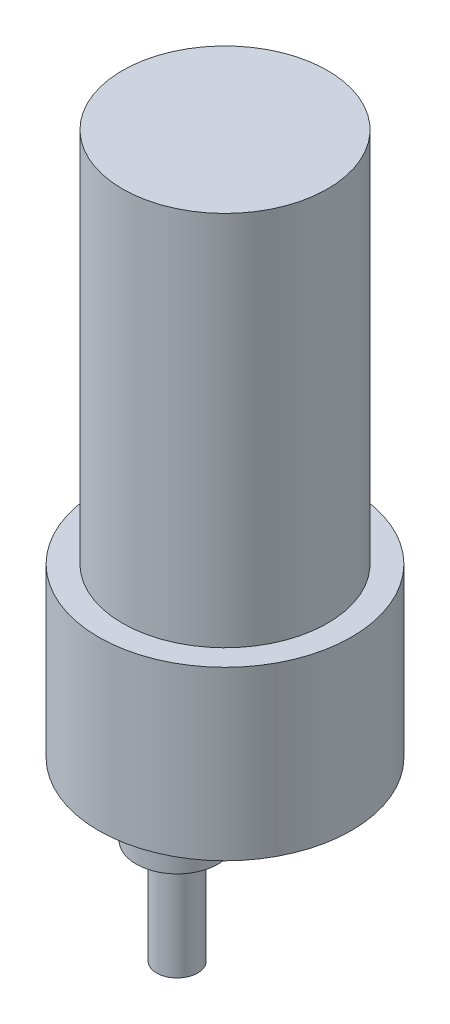
ISO-10303-21;
HEADER;
FILE_DESCRIPTION(('STEP AP214'),'2;1');
FILE_NAME('part.step','',(''),(''),'','','');
FILE_SCHEMA(('AUTOMOTIVE_DESIGN { 1 0 10303 214 1 1 1 1 }'));
ENDSEC;
DATA;
#1=APPLICATION_CONTEXT('core data for automotive mechanical design processes');
#2=APPLICATION_PROTOCOL_DEFINITION('international standard','automotive_design',2000,#1);
#3=PRODUCT_CONTEXT('',#1,'mechanical');
#4=PRODUCT('Part','Part','',(#3));
#5=PRODUCT_RELATED_PRODUCT_CATEGORY('part','',(#4));
#6=PRODUCT_DEFINITION_FORMATION('','',#4);
#7=PRODUCT_DEFINITION_CONTEXT('part definition',#1,'design');
#8=PRODUCT_DEFINITION('design','',#6,#7);
#9=PRODUCT_DEFINITION_SHAPE('','',#8);
#10=(LENGTH_UNIT() NAMED_UNIT(*) SI_UNIT(.MILLI.,.METRE.));
#11=(NAMED_UNIT(*) PLANE_ANGLE_UNIT() SI_UNIT($,.RADIAN.));
#12=(NAMED_UNIT(*) SI_UNIT($,.STERADIAN.) SOLID_ANGLE_UNIT());
#13=UNCERTAINTY_MEASURE_WITH_UNIT(LENGTH_MEASURE(1.E-05),#10,'distance_accuracy_value','');
#14=(GEOMETRIC_REPRESENTATION_CONTEXT(3) GLOBAL_UNCERTAINTY_ASSIGNED_CONTEXT((#13)) GLOBAL_UNIT_ASSIGNED_CONTEXT((#10,
#11,#12)) REPRESENTATION_CONTEXT('',''));
#15=CARTESIAN_POINT('',(0.,0.,0.));
#16=DIRECTION('',(0.,0.,1.));
#17=DIRECTION('',(1.,0.,0.));
#18=AXIS2_PLACEMENT_3D('',#15,#16,#17);
#19=CARTESIAN_POINT('',(0.,24.5,0.));
#20=DIRECTION('',(0.,-1.,0.));
#21=DIRECTION('',(0.,0.,-1.));
#22=AXIS2_PLACEMENT_3D('',#19,#20,#21);
#23=CYLINDRICAL_SURFACE('',#22,18.5);
#24=CARTESIAN_POINT('',(0.,24.5,0.));
#25=DIRECTION('',(0.,1.,0.));
#26=DIRECTION('',(0.,0.,1.));
#27=AXIS2_PLACEMENT_3D('',#24,#25,#26);
#28=CIRCLE('',#27,18.5);
#29=CARTESIAN_POINT('',(0.,24.5,18.5));
#30=VERTEX_POINT('',#29);
#31=EDGE_CURVE('E151',#30,#30,#28,.T.);
#32=ORIENTED_EDGE('',*,*,#31,.F.);
#33=EDGE_LOOP('',(#32));
#34=FACE_BOUND('',#33,.T.);
#35=CARTESIAN_POINT('',(0.,0.,0.));
#36=DIRECTION('',(0.,1.,0.));
#37=DIRECTION('',(0.,0.,1.));
#38=AXIS2_PLACEMENT_3D('',#35,#36,#37);
#39=CIRCLE('',#38,18.5);
#40=CARTESIAN_POINT('',(0.,0.,18.5));
#41=VERTEX_POINT('',#40);
#42=EDGE_CURVE('E41',#41,#41,#39,.T.);
#43=ORIENTED_EDGE('',*,*,#42,.T.);
#44=EDGE_LOOP('',(#43));
#45=FACE_BOUND('',#44,.T.);
#46=ADVANCED_FACE('F38',(#34,#45),#23,.T.);
#47=CARTESIAN_POINT('',(0.,24.5,0.));
#48=DIRECTION('',(0.,1.,0.));
#49=DIRECTION('',(0.,0.,1.));
#50=AXIS2_PLACEMENT_3D('',#47,#48,#49);
#51=PLANE('',#50);
#52=CARTESIAN_POINT('',(0.,24.5,0.));
#53=DIRECTION('',(0.,1.,0.));
#54=DIRECTION('',(0.,0.,1.));
#55=AXIS2_PLACEMENT_3D('',#52,#53,#54);
#56=CIRCLE('',#55,15.);
#57=CARTESIAN_POINT('',(0.,24.5,15.));
#58=VERTEX_POINT('',#57);
#59=EDGE_CURVE('E46',#58,#58,#56,.T.);
#60=ORIENTED_EDGE('',*,*,#59,.F.);
#61=EDGE_LOOP('',(#60));
#62=FACE_BOUND('',#61,.T.);
#63=ORIENTED_EDGE('',*,*,#31,.T.);
#64=EDGE_LOOP('',(#63));
#65=FACE_BOUND('',#64,.T.);
#66=ADVANCED_FACE('F162',(#62,#65),#51,.T.);
#67=CARTESIAN_POINT('',(0.,0.,0.));
#68=DIRECTION('',(0.,1.,0.));
#69=DIRECTION('',(0.,0.,1.));
#70=AXIS2_PLACEMENT_3D('',#67,#68,#69);
#71=PLANE('',#70);
#72=CARTESIAN_POINT('',(7.75000000000016,0.,13.4233937586587));
#73=DIRECTION('',(0.,-1.,0.));
#74=DIRECTION('',(0.,0.,-1.));
#75=AXIS2_PLACEMENT_3D('',#72,#73,#74);
#76=CIRCLE('',#75,1.24999999999999);
#77=CARTESIAN_POINT('',(7.75000000000016,0.,12.1733937586587));
#78=VERTEX_POINT('',#77);
#79=EDGE_CURVE('E97',#78,#78,#76,.T.);
#80=ORIENTED_EDGE('',*,*,#79,.F.);
#81=EDGE_LOOP('',(#80));
#82=FACE_BOUND('',#81,.T.);
#83=CARTESIAN_POINT('',(-7.74999999999988,0.,13.4233937586589));
#84=DIRECTION('',(0.,-1.,0.));
#85=DIRECTION('',(0.,0.,-1.));
#86=AXIS2_PLACEMENT_3D('',#83,#84,#85);
#87=CIRCLE('',#86,1.24999999999999);
#88=CARTESIAN_POINT('',(-7.74999999999988,0.,12.1733937586589));
#89=VERTEX_POINT('',#88);
#90=EDGE_CURVE('E96',#89,#89,#87,.T.);
#91=ORIENTED_EDGE('',*,*,#90,.F.);
#92=EDGE_LOOP('',(#91));
#93=FACE_BOUND('',#92,.T.);
#94=CARTESIAN_POINT('',(-15.5,0.,0.));
#95=DIRECTION('',(0.,-1.,0.));
#96=DIRECTION('',(0.,0.,-1.));
#97=AXIS2_PLACEMENT_3D('',#94,#95,#96);
#98=CIRCLE('',#97,1.24999999999999);
#99=CARTESIAN_POINT('',(-15.5,0.,-1.24999999999999));
#100=VERTEX_POINT('',#99);
#101=EDGE_CURVE('E107',#100,#100,#98,.T.);
#102=ORIENTED_EDGE('',*,*,#101,.F.);
#103=EDGE_LOOP('',(#102));
#104=FACE_BOUND('',#103,.T.);
#105=CARTESIAN_POINT('',(-7.75000000000006,0.,-13.4233937586588));
#106=DIRECTION('',(0.,-1.,0.));
#107=DIRECTION('',(0.,0.,-1.));
#108=AXIS2_PLACEMENT_3D('',#105,#106,#107);
#109=CIRCLE('',#108,1.24999999999999);
#110=CARTESIAN_POINT('',(-7.75000000000006,0.,-14.6733937586588));
#111=VERTEX_POINT('',#110);
#112=EDGE_CURVE('E113',#111,#111,#109,.T.);
#113=ORIENTED_EDGE('',*,*,#112,.F.);
#114=EDGE_LOOP('',(#113));
#115=FACE_BOUND('',#114,.T.);
#116=CARTESIAN_POINT('',(7.74999999999997,0.,-13.4233937586588));
#117=DIRECTION('',(0.,-1.,0.));
#118=DIRECTION('',(0.,0.,-1.));
#119=AXIS2_PLACEMENT_3D('',#116,#117,#118);
#120=CIRCLE('',#119,1.24999999999999);
#121=CARTESIAN_POINT('',(7.74999999999997,0.,-14.6733937586588));
#122=VERTEX_POINT('',#121);
#123=EDGE_CURVE('E119',#122,#122,#120,.T.);
#124=ORIENTED_EDGE('',*,*,#123,.F.);
#125=EDGE_LOOP('',(#124));
#126=FACE_BOUND('',#125,.T.);
#127=CARTESIAN_POINT('',(15.5,0.,0.));
#128=DIRECTION('',(0.,-1.,0.));
#129=DIRECTION('',(0.,0.,-1.));
#130=AXIS2_PLACEMENT_3D('',#127,#128,#129);
#131=CIRCLE('',#130,1.24999999999999);
#132=CARTESIAN_POINT('',(15.5,0.,-1.24999999999999));
#133=VERTEX_POINT('',#132);
#134=EDGE_CURVE('E125',#133,#133,#131,.T.);
#135=ORIENTED_EDGE('',*,*,#134,.F.);
#136=EDGE_LOOP('',(#135));
#137=FACE_BOUND('',#136,.T.);
#138=CARTESIAN_POINT('',(0.,0.,7.));
#139=DIRECTION('',(0.,1.,0.));
#140=DIRECTION('',(0.,0.,1.));
#141=AXIS2_PLACEMENT_3D('',#138,#139,#140);
#142=CIRCLE('',#141,6.);
#143=CARTESIAN_POINT('',(0.,0.,13.));
#144=VERTEX_POINT('',#143);
#145=EDGE_CURVE('E140',#144,#144,#142,.T.);
#146=ORIENTED_EDGE('',*,*,#145,.T.);
#147=EDGE_LOOP('',(#146));
#148=FACE_BOUND('',#147,.T.);
#149=ORIENTED_EDGE('',*,*,#42,.F.);
#150=EDGE_LOOP('',(#149));
#151=FACE_BOUND('',#150,.T.);
#152=ADVANCED_FACE('F159',(#82,#93,#104,#115,#126,#137,#148,#151),#71,.F.);
#153=CARTESIAN_POINT('',(0.,79.5,0.));
#154=DIRECTION('',(0.,-1.,0.));
#155=DIRECTION('',(0.,0.,-1.));
#156=AXIS2_PLACEMENT_3D('',#153,#154,#155);
#157=CYLINDRICAL_SURFACE('',#156,15.);
#158=CARTESIAN_POINT('',(0.,79.5,0.));
#159=DIRECTION('',(0.,1.,0.));
#160=DIRECTION('',(0.,0.,1.));
#161=AXIS2_PLACEMENT_3D('',#158,#159,#160);
#162=CIRCLE('',#161,15.);
#163=CARTESIAN_POINT('',(0.,79.5,15.));
#164=VERTEX_POINT('',#163);
#165=EDGE_CURVE('E145',#164,#164,#162,.T.);
#166=ORIENTED_EDGE('',*,*,#165,.F.);
#167=EDGE_LOOP('',(#166));
#168=FACE_BOUND('',#167,.T.);
#169=ORIENTED_EDGE('',*,*,#59,.T.);
#170=EDGE_LOOP('',(#169));
#171=FACE_BOUND('',#170,.T.);
#172=ADVANCED_FACE('F161',(#168,#171),#157,.T.);
#173=CARTESIAN_POINT('',(0.,79.5,0.));
#174=DIRECTION('',(0.,1.,0.));
#175=DIRECTION('',(0.,0.,1.));
#176=AXIS2_PLACEMENT_3D('',#173,#174,#175);
#177=PLANE('',#176);
#178=ORIENTED_EDGE('',*,*,#165,.T.);
#179=EDGE_LOOP('',(#178));
#180=FACE_BOUND('',#179,.T.);
#181=ADVANCED_FACE('F168',(#180),#177,.T.);
#182=CARTESIAN_POINT('',(0.,-7.,7.));
#183=DIRECTION('',(0.,1.,0.));
#184=DIRECTION('',(0.,0.,1.));
#185=AXIS2_PLACEMENT_3D('',#182,#183,#184);
#186=CYLINDRICAL_SURFACE('',#185,6.);
#187=CARTESIAN_POINT('',(0.,-7.,7.));
#188=DIRECTION('',(0.,1.,0.));
#189=DIRECTION('',(0.,0.,1.));
#190=AXIS2_PLACEMENT_3D('',#187,#188,#189);
#191=CIRCLE('',#190,6.);
#192=CARTESIAN_POINT('',(0.,-7.,13.));
#193=VERTEX_POINT('',#192);
#194=EDGE_CURVE('E142',#193,#193,#191,.T.);
#195=ORIENTED_EDGE('',*,*,#194,.T.);
#196=EDGE_LOOP('',(#195));
#197=FACE_BOUND('',#196,.T.);
#198=ORIENTED_EDGE('',*,*,#145,.F.);
#199=EDGE_LOOP('',(#198));
#200=FACE_BOUND('',#199,.T.);
#201=ADVANCED_FACE('F199',(#197,#200),#186,.T.);
#202=CARTESIAN_POINT('',(0.,-7.,7.));
#203=DIRECTION('',(0.,1.,0.));
#204=DIRECTION('',(0.,0.,1.));
#205=AXIS2_PLACEMENT_3D('',#202,#203,#204);
#206=PLANE('',#205);
#207=CARTESIAN_POINT('',(0.,-7.,7.));
#208=DIRECTION('',(0.,-1.,0.));
#209=DIRECTION('',(0.,0.,-1.));
#210=AXIS2_PLACEMENT_3D('',#207,#208,#209);
#211=CIRCLE('',#210,3.);
#212=CARTESIAN_POINT('',(0.,-7.,4.));
#213=VERTEX_POINT('',#212);
#214=EDGE_CURVE('E11',#213,#213,#211,.T.);
#215=ORIENTED_EDGE('',*,*,#214,.F.);
#216=EDGE_LOOP('',(#215));
#217=FACE_BOUND('',#216,.T.);
#218=ORIENTED_EDGE('',*,*,#194,.F.);
#219=EDGE_LOOP('',(#218));
#220=FACE_BOUND('',#219,.T.);
#221=ADVANCED_FACE('F209',(#217,#220),#206,.F.);
#222=CARTESIAN_POINT('',(0.,-22.3,7.));
#223=DIRECTION('',(0.,1.,0.));
#224=DIRECTION('',(0.,0.,1.));
#225=AXIS2_PLACEMENT_3D('',#222,#223,#224);
#226=CYLINDRICAL_SURFACE('',#225,3.);
#227=CARTESIAN_POINT('',(0.,-22.3,7.));
#228=DIRECTION('',(0.,-1.,0.));
#229=DIRECTION('',(0.,0.,-1.));
#230=AXIS2_PLACEMENT_3D('',#227,#228,#229);
#231=CIRCLE('',#230,3.);
#232=CARTESIAN_POINT('',(1.73132896931808,-22.3,4.55));
#233=VERTEX_POINT('',#232);
#234=CARTESIAN_POINT('',(-1.73132896931808,-22.3,4.55));
#235=VERTEX_POINT('',#234);
#236=EDGE_CURVE('E137',#233,#235,#231,.T.);
#237=ORIENTED_EDGE('',*,*,#236,.F.);
#238=DIRECTION('',(0.,-1.,0.));
#239=VECTOR('',#238,1.);
#240=CARTESIAN_POINT('',(1.73132896931808,-10.3,4.55));
#241=LINE('',#240,#239);
#242=CARTESIAN_POINT('',(1.73132896931808,-10.3,4.55));
#243=VERTEX_POINT('',#242);
#244=EDGE_CURVE('E54',#243,#233,#241,.T.);
#245=ORIENTED_EDGE('',*,*,#244,.F.);
#246=CARTESIAN_POINT('',(0.,-10.3,7.));
#247=DIRECTION('',(0.,-1.,0.));
#248=DIRECTION('',(0.,0.,-1.));
#249=AXIS2_PLACEMENT_3D('',#246,#247,#248);
#250=CIRCLE('',#249,3.);
#251=CARTESIAN_POINT('',(-1.73132896931808,-10.3,4.55));
#252=VERTEX_POINT('',#251);
#253=EDGE_CURVE('E131',#252,#243,#250,.T.);
#254=ORIENTED_EDGE('',*,*,#253,.F.);
#255=DIRECTION('',(0.,-1.,0.));
#256=VECTOR('',#255,1.);
#257=CARTESIAN_POINT('',(-1.73132896931808,-10.3,4.55));
#258=LINE('',#257,#256);
#259=EDGE_CURVE('E60',#252,#235,#258,.T.);
#260=ORIENTED_EDGE('',*,*,#259,.T.);
#261=EDGE_LOOP('',(#237,#245,#254,#260));
#262=FACE_BOUND('',#261,.T.);
#263=ORIENTED_EDGE('',*,*,#214,.T.);
#264=EDGE_LOOP('',(#263));
#265=FACE_BOUND('',#264,.T.);
#266=ADVANCED_FACE('F219',(#262,#265),#226,.T.);
#267=CARTESIAN_POINT('',(0.,-22.3,7.));
#268=DIRECTION('',(0.,-1.,0.));
#269=DIRECTION('',(0.,0.,-1.));
#270=AXIS2_PLACEMENT_3D('',#267,#268,#269);
#271=PLANE('',#270);
#272=DIRECTION('',(-1.,0.,0.));
#273=VECTOR('',#272,1.);
#274=CARTESIAN_POINT('',(-1.73132896931808,-22.3,4.55));
#275=LINE('',#274,#273);
#276=EDGE_CURVE('E67',#233,#235,#275,.T.);
#277=ORIENTED_EDGE('',*,*,#276,.F.);
#278=ORIENTED_EDGE('',*,*,#236,.T.);
#279=EDGE_LOOP('',(#277,#278));
#280=FACE_BOUND('',#279,.T.);
#281=ADVANCED_FACE('F229',(#280),#271,.T.);
#282=CARTESIAN_POINT('',(-1.73132896931808,-10.3,4.55));
#283=DIRECTION('',(0.,0.,1.));
#284=DIRECTION('',(1.,0.,0.));
#285=AXIS2_PLACEMENT_3D('',#282,#283,#284);
#286=PLANE('',#285);
#287=ORIENTED_EDGE('',*,*,#276,.T.);
#288=ORIENTED_EDGE('',*,*,#259,.F.);
#289=DIRECTION('',(-1.,0.,0.));
#290=VECTOR('',#289,1.);
#291=CARTESIAN_POINT('',(-1.73132896931808,-10.3,4.55));
#292=LINE('',#291,#290);
#293=EDGE_CURVE('E133',#243,#252,#292,.T.);
#294=ORIENTED_EDGE('',*,*,#293,.F.);
#295=ORIENTED_EDGE('',*,*,#244,.T.);
#296=EDGE_LOOP('',(#287,#288,#294,#295));
#297=FACE_BOUND('',#296,.T.);
#298=ADVANCED_FACE('F239',(#297),#286,.F.);
#299=CARTESIAN_POINT('',(0.,-10.3,7.));
#300=DIRECTION('',(0.,-1.,0.));
#301=DIRECTION('',(0.,0.,-1.));
#302=AXIS2_PLACEMENT_3D('',#299,#300,#301);
#303=PLANE('',#302);
#304=ORIENTED_EDGE('',*,*,#253,.T.);
#305=ORIENTED_EDGE('',*,*,#293,.T.);
#306=EDGE_LOOP('',(#304,#305));
#307=FACE_BOUND('',#306,.T.);
#308=ADVANCED_FACE('F249',(#307),#303,.T.);
#309=CARTESIAN_POINT('',(15.5,5.,0.));
#310=DIRECTION('',(0.,-1.,0.));
#311=DIRECTION('',(0.,0.,-1.));
#312=AXIS2_PLACEMENT_3D('',#309,#310,#311);
#313=CONICAL_SURFACE('',#312,1.25,1.02974425867665);
#314=CARTESIAN_POINT('',(15.5,5.75107577378445,0.));
#315=VERTEX_POINT('',#314);
#316=VERTEX_LOOP('',#315);
#317=FACE_BOUND('',#316,.T.);
#318=CARTESIAN_POINT('',(15.5,5.,0.));
#319=DIRECTION('',(0.,-1.,0.));
#320=DIRECTION('',(0.,0.,-1.));
#321=AXIS2_PLACEMENT_3D('',#318,#319,#320);
#322=CIRCLE('',#321,1.25);
#323=CARTESIAN_POINT('',(15.5,5.,-1.25));
#324=VERTEX_POINT('',#323);
#325=EDGE_CURVE('E128',#324,#324,#322,.T.);
#326=ORIENTED_EDGE('',*,*,#325,.T.);
#327=EDGE_LOOP('',(#326));
#328=FACE_BOUND('',#327,.T.);
#329=ADVANCED_FACE('F258',(#317,#328),#313,.F.);
#330=CARTESIAN_POINT('',(15.5,0.,0.));
#331=DIRECTION('',(0.,-1.,0.));
#332=DIRECTION('',(0.,0.,-1.));
#333=AXIS2_PLACEMENT_3D('',#330,#331,#332);
#334=CYLINDRICAL_SURFACE('',#333,1.24999999999999);
#335=ORIENTED_EDGE('',*,*,#325,.F.);
#336=EDGE_LOOP('',(#335));
#337=FACE_BOUND('',#336,.T.);
#338=ORIENTED_EDGE('',*,*,#134,.T.);
#339=EDGE_LOOP('',(#338));
#340=FACE_BOUND('',#339,.T.);
#341=ADVANCED_FACE('F268',(#337,#340),#334,.F.);
#342=CARTESIAN_POINT('',(7.74999999999997,5.,-13.4233937586588));
#343=DIRECTION('',(0.,-1.,0.));
#344=DIRECTION('',(0.,0.,-1.));
#345=AXIS2_PLACEMENT_3D('',#342,#343,#344);
#346=CONICAL_SURFACE('',#345,1.25,1.02974425867665);
#347=CARTESIAN_POINT('',(7.74999999999997,5.75107577378445,-13.4233937586588));
#348=VERTEX_POINT('',#347);
#349=VERTEX_LOOP('',#348);
#350=FACE_BOUND('',#349,.T.);
#351=CARTESIAN_POINT('',(7.74999999999997,5.,-13.4233937586588));
#352=DIRECTION('',(0.,-1.,0.));
#353=DIRECTION('',(0.,0.,-1.));
#354=AXIS2_PLACEMENT_3D('',#351,#352,#353);
#355=CIRCLE('',#354,1.25);
#356=CARTESIAN_POINT('',(7.74999999999997,5.,-14.6733937586588));
#357=VERTEX_POINT('',#356);
#358=EDGE_CURVE('E122',#357,#357,#355,.T.);
#359=ORIENTED_EDGE('',*,*,#358,.T.);
#360=EDGE_LOOP('',(#359));
#361=FACE_BOUND('',#360,.T.);
#362=ADVANCED_FACE('F278',(#350,#361),#346,.F.);
#363=CARTESIAN_POINT('',(7.74999999999997,0.,-13.4233937586588));
#364=DIRECTION('',(0.,-1.,0.));
#365=DIRECTION('',(0.,0.,-1.));
#366=AXIS2_PLACEMENT_3D('',#363,#364,#365);
#367=CYLINDRICAL_SURFACE('',#366,1.24999999999999);
#368=ORIENTED_EDGE('',*,*,#358,.F.);
#369=EDGE_LOOP('',(#368));
#370=FACE_BOUND('',#369,.T.);
#371=ORIENTED_EDGE('',*,*,#123,.T.);
#372=EDGE_LOOP('',(#371));
#373=FACE_BOUND('',#372,.T.);
#374=ADVANCED_FACE('F299',(#370,#373),#367,.F.);
#375=CARTESIAN_POINT('',(-7.75000000000006,5.,-13.4233937586588));
#376=DIRECTION('',(0.,-1.,0.));
#377=DIRECTION('',(0.,0.,-1.));
#378=AXIS2_PLACEMENT_3D('',#375,#376,#377);
#379=CONICAL_SURFACE('',#378,1.25,1.02974425867665);
#380=CARTESIAN_POINT('',(-7.75000000000006,5.75107577378445,-13.4233937586588));
#381=VERTEX_POINT('',#380);
#382=VERTEX_LOOP('',#381);
#383=FACE_BOUND('',#382,.T.);
#384=CARTESIAN_POINT('',(-7.75000000000006,5.,-13.4233937586588));
#385=DIRECTION('',(0.,-1.,0.));
#386=DIRECTION('',(0.,0.,-1.));
#387=AXIS2_PLACEMENT_3D('',#384,#385,#386);
#388=CIRCLE('',#387,1.25);
#389=CARTESIAN_POINT('',(-7.75000000000006,5.,-14.6733937586588));
#390=VERTEX_POINT('',#389);
#391=EDGE_CURVE('E116',#390,#390,#388,.T.);
#392=ORIENTED_EDGE('',*,*,#391,.T.);
#393=EDGE_LOOP('',(#392));
#394=FACE_BOUND('',#393,.T.);
#395=ADVANCED_FACE('F310',(#383,#394),#379,.F.);
#396=CARTESIAN_POINT('',(-7.75000000000006,0.,-13.4233937586588));
#397=DIRECTION('',(0.,-1.,0.));
#398=DIRECTION('',(0.,0.,-1.));
#399=AXIS2_PLACEMENT_3D('',#396,#397,#398);
#400=CYLINDRICAL_SURFACE('',#399,1.24999999999999);
#401=ORIENTED_EDGE('',*,*,#391,.F.);
#402=EDGE_LOOP('',(#401));
#403=FACE_BOUND('',#402,.T.);
#404=ORIENTED_EDGE('',*,*,#112,.T.);
#405=EDGE_LOOP('',(#404));
#406=FACE_BOUND('',#405,.T.);
#407=ADVANCED_FACE('F320',(#403,#406),#400,.F.);
#408=CARTESIAN_POINT('',(-15.5,5.,0.));
#409=DIRECTION('',(0.,-1.,0.));
#410=DIRECTION('',(0.,0.,-1.));
#411=AXIS2_PLACEMENT_3D('',#408,#409,#410);
#412=CONICAL_SURFACE('',#411,1.25,1.02974425867665);
#413=CARTESIAN_POINT('',(-15.5,5.75107577378445,0.));
#414=VERTEX_POINT('',#413);
#415=VERTEX_LOOP('',#414);
#416=FACE_BOUND('',#415,.T.);
#417=CARTESIAN_POINT('',(-15.5,5.,0.));
#418=DIRECTION('',(0.,-1.,0.));
#419=DIRECTION('',(0.,0.,-1.));
#420=AXIS2_PLACEMENT_3D('',#417,#418,#419);
#421=CIRCLE('',#420,1.25);
#422=CARTESIAN_POINT('',(-15.5,5.,-1.25));
#423=VERTEX_POINT('',#422);
#424=EDGE_CURVE('E110',#423,#423,#421,.T.);
#425=ORIENTED_EDGE('',*,*,#424,.T.);
#426=EDGE_LOOP('',(#425));
#427=FACE_BOUND('',#426,.T.);
#428=ADVANCED_FACE('F331',(#416,#427),#412,.F.);
#429=CARTESIAN_POINT('',(-15.5,0.,0.));
#430=DIRECTION('',(0.,-1.,0.));
#431=DIRECTION('',(0.,0.,-1.));
#432=AXIS2_PLACEMENT_3D('',#429,#430,#431);
#433=CYLINDRICAL_SURFACE('',#432,1.24999999999999);
#434=ORIENTED_EDGE('',*,*,#424,.F.);
#435=EDGE_LOOP('',(#434));
#436=FACE_BOUND('',#435,.T.);
#437=ORIENTED_EDGE('',*,*,#101,.T.);
#438=EDGE_LOOP('',(#437));
#439=FACE_BOUND('',#438,.T.);
#440=ADVANCED_FACE('F343',(#436,#439),#433,.F.);
#441=CARTESIAN_POINT('',(-7.74999999999988,5.,13.4233937586589));
#442=DIRECTION('',(0.,-1.,0.));
#443=DIRECTION('',(0.,0.,-1.));
#444=AXIS2_PLACEMENT_3D('',#441,#442,#443);
#445=CONICAL_SURFACE('',#444,1.25,1.02974425867665);
#446=CARTESIAN_POINT('',(-7.74999999999988,5.75107577378445,13.4233937586589));
#447=VERTEX_POINT('',#446);
#448=VERTEX_LOOP('',#447);
#449=FACE_BOUND('',#448,.T.);
#450=CARTESIAN_POINT('',(-7.74999999999988,5.,13.4233937586589));
#451=DIRECTION('',(0.,-1.,0.));
#452=DIRECTION('',(0.,0.,-1.));
#453=AXIS2_PLACEMENT_3D('',#450,#451,#452);
#454=CIRCLE('',#453,1.25);
#455=CARTESIAN_POINT('',(-7.74999999999988,5.,12.1733937586589));
#456=VERTEX_POINT('',#455);
#457=EDGE_CURVE('E100',#456,#456,#454,.T.);
#458=ORIENTED_EDGE('',*,*,#457,.T.);
#459=EDGE_LOOP('',(#458));
#460=FACE_BOUND('',#459,.T.);
#461=ADVANCED_FACE('F354',(#449,#460),#445,.F.);
#462=CARTESIAN_POINT('',(-7.74999999999988,0.,13.4233937586589));
#463=DIRECTION('',(0.,-1.,0.));
#464=DIRECTION('',(0.,0.,-1.));
#465=AXIS2_PLACEMENT_3D('',#462,#463,#464);
#466=CYLINDRICAL_SURFACE('',#465,1.24999999999999);
#467=ORIENTED_EDGE('',*,*,#457,.F.);
#468=EDGE_LOOP('',(#467));
#469=FACE_BOUND('',#468,.T.);
#470=ORIENTED_EDGE('',*,*,#90,.T.);
#471=EDGE_LOOP('',(#470));
#472=FACE_BOUND('',#471,.T.);
#473=ADVANCED_FACE('F90',(#469,#472),#466,.F.);
#474=CARTESIAN_POINT('',(7.75000000000016,5.,13.4233937586587));
#475=DIRECTION('',(0.,-1.,0.));
#476=DIRECTION('',(0.,0.,-1.));
#477=AXIS2_PLACEMENT_3D('',#474,#475,#476);
#478=CONICAL_SURFACE('',#477,1.25,1.02974425867665);
#479=CARTESIAN_POINT('',(7.75000000000015,5.75107577378445,13.4233937586587));
#480=VERTEX_POINT('',#479);
#481=VERTEX_LOOP('',#480);
#482=FACE_BOUND('',#481,.T.);
#483=CARTESIAN_POINT('',(7.75000000000016,5.,13.4233937586587));
#484=DIRECTION('',(0.,-1.,0.));
#485=DIRECTION('',(0.,0.,-1.));
#486=AXIS2_PLACEMENT_3D('',#483,#484,#485);
#487=CIRCLE('',#486,1.25);
#488=CARTESIAN_POINT('',(7.75000000000016,5.,12.1733937586587));
#489=VERTEX_POINT('',#488);
#490=EDGE_CURVE('E94',#489,#489,#487,.T.);
#491=ORIENTED_EDGE('',*,*,#490,.T.);
#492=EDGE_LOOP('',(#491));
#493=FACE_BOUND('',#492,.T.);
#494=ADVANCED_FACE('F86',(#482,#493),#478,.F.);
#495=CARTESIAN_POINT('',(7.75000000000016,0.,13.4233937586587));
#496=DIRECTION('',(0.,-1.,0.));
#497=DIRECTION('',(0.,0.,-1.));
#498=AXIS2_PLACEMENT_3D('',#495,#496,#497);
#499=CYLINDRICAL_SURFACE('',#498,1.24999999999999);
#500=ORIENTED_EDGE('',*,*,#490,.F.);
#501=EDGE_LOOP('',(#500));
#502=FACE_BOUND('',#501,.T.);
#503=ORIENTED_EDGE('',*,*,#79,.T.);
#504=EDGE_LOOP('',(#503));
#505=FACE_BOUND('',#504,.T.);
#506=ADVANCED_FACE('F89',(#502,#505),#499,.F.);
#507=CLOSED_SHELL('',(#46,#66,#152,#172,#181,#201,#221,#266,#281,#298,#308,#329,#341,#362,#374,
#395,#407,#428,#440,#461,#473,#494,#506));
#508=MANIFOLD_SOLID_BREP('B2',#507);
#509=ADVANCED_BREP_SHAPE_REPRESENTATION('',(#18,#508),#14);
#510=SHAPE_DEFINITION_REPRESENTATION(#9,#509);
ENDSEC;
END-ISO-10303-21;
